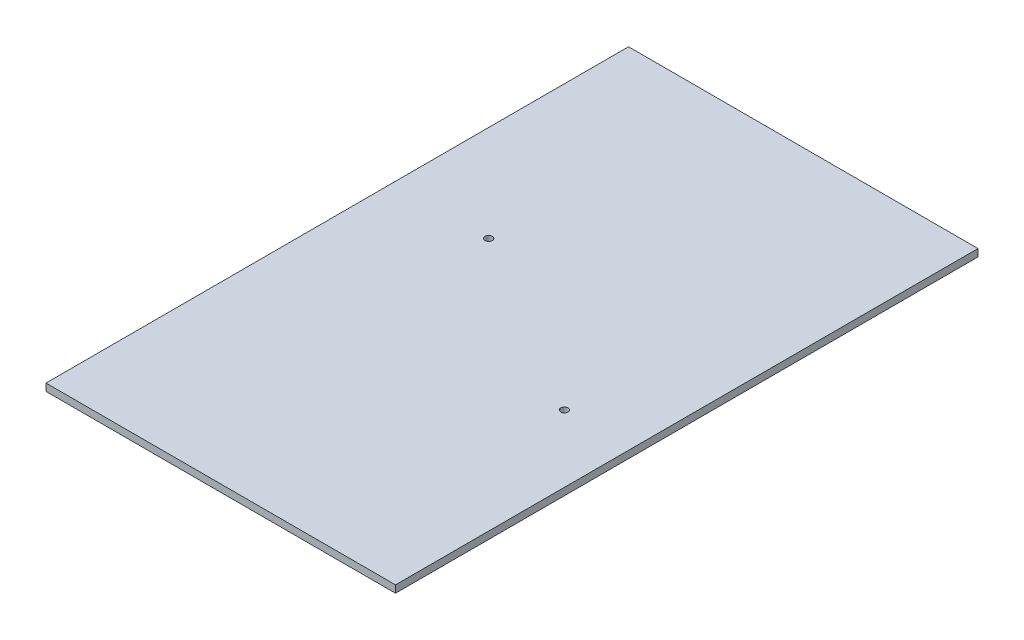
ISO-10303-21;
HEADER;
FILE_DESCRIPTION(('STEP AP214'),'2;1');
FILE_NAME('part.step','',(''),(''),'','','');
FILE_SCHEMA(('AUTOMOTIVE_DESIGN { 1 0 10303 214 1 1 1 1 }'));
ENDSEC;
DATA;
#1=APPLICATION_CONTEXT('core data for automotive mechanical design processes');
#2=APPLICATION_PROTOCOL_DEFINITION('international standard','automotive_design',2000,#1);
#3=PRODUCT_CONTEXT('',#1,'mechanical');
#4=PRODUCT('Part','Part','',(#3));
#5=PRODUCT_RELATED_PRODUCT_CATEGORY('part','',(#4));
#6=PRODUCT_DEFINITION_FORMATION('','',#4);
#7=PRODUCT_DEFINITION_CONTEXT('part definition',#1,'design');
#8=PRODUCT_DEFINITION('design','',#6,#7);
#9=PRODUCT_DEFINITION_SHAPE('','',#8);
#10=(LENGTH_UNIT() NAMED_UNIT(*) SI_UNIT(.MILLI.,.METRE.));
#11=(NAMED_UNIT(*) PLANE_ANGLE_UNIT() SI_UNIT($,.RADIAN.));
#12=(NAMED_UNIT(*) SI_UNIT($,.STERADIAN.) SOLID_ANGLE_UNIT());
#13=UNCERTAINTY_MEASURE_WITH_UNIT(LENGTH_MEASURE(1.E-05),#10,'distance_accuracy_value','');
#14=(GEOMETRIC_REPRESENTATION_CONTEXT(3) GLOBAL_UNCERTAINTY_ASSIGNED_CONTEXT((#13)) GLOBAL_UNIT_ASSIGNED_CONTEXT((#10,
#11,#12)) REPRESENTATION_CONTEXT('',''));
#15=CARTESIAN_POINT('',(0.,0.,0.));
#16=DIRECTION('',(0.,0.,1.));
#17=DIRECTION('',(1.,0.,0.));
#18=AXIS2_PLACEMENT_3D('',#15,#16,#17);
#19=CARTESIAN_POINT('',(76.2,3.175,127.));
#20=DIRECTION('',(-1.,0.,0.));
#21=DIRECTION('',(0.,0.,1.));
#22=AXIS2_PLACEMENT_3D('',#19,#20,#21);
#23=PLANE('',#22);
#24=DIRECTION('',(0.,0.,-1.));
#25=VECTOR('',#24,1.);
#26=CARTESIAN_POINT('',(76.2,0.,127.));
#27=LINE('',#26,#25);
#28=CARTESIAN_POINT('',(76.2,0.,127.));
#29=VERTEX_POINT('',#28);
#30=CARTESIAN_POINT('',(76.2,0.,-127.));
#31=VERTEX_POINT('',#30);
#32=EDGE_CURVE('E95',#29,#31,#27,.T.);
#33=ORIENTED_EDGE('',*,*,#32,.T.);
#34=DIRECTION('',(0.,-1.,0.));
#35=VECTOR('',#34,1.);
#36=CARTESIAN_POINT('',(76.2,3.175,-127.));
#37=LINE('',#36,#35);
#38=CARTESIAN_POINT('',(76.2,3.175,-127.));
#39=VERTEX_POINT('',#38);
#40=EDGE_CURVE('E11',#39,#31,#37,.T.);
#41=ORIENTED_EDGE('',*,*,#40,.F.);
#42=DIRECTION('',(0.,0.,-1.));
#43=VECTOR('',#42,1.);
#44=CARTESIAN_POINT('',(76.2,3.175,127.));
#45=LINE('',#44,#43);
#46=CARTESIAN_POINT('',(76.2,3.175,127.));
#47=VERTEX_POINT('',#46);
#48=EDGE_CURVE('E83',#47,#39,#45,.T.);
#49=ORIENTED_EDGE('',*,*,#48,.F.);
#50=DIRECTION('',(0.,-1.,0.));
#51=VECTOR('',#50,1.);
#52=CARTESIAN_POINT('',(76.2,3.175,127.));
#53=LINE('',#52,#51);
#54=EDGE_CURVE('E91',#47,#29,#53,.T.);
#55=ORIENTED_EDGE('',*,*,#54,.T.);
#56=EDGE_LOOP('',(#33,#41,#49,#55));
#57=FACE_BOUND('',#56,.T.);
#58=ADVANCED_FACE('F32',(#57),#23,.F.);
#59=CARTESIAN_POINT('',(-76.2,3.175,-127.));
#60=DIRECTION('',(0.,0.,1.));
#61=DIRECTION('',(1.,0.,0.));
#62=AXIS2_PLACEMENT_3D('',#59,#60,#61);
#63=PLANE('',#62);
#64=DIRECTION('',(-1.,0.,0.));
#65=VECTOR('',#64,1.);
#66=CARTESIAN_POINT('',(-76.2,0.,-127.));
#67=LINE('',#66,#65);
#68=CARTESIAN_POINT('',(-76.2,0.,-127.));
#69=VERTEX_POINT('',#68);
#70=EDGE_CURVE('E87',#31,#69,#67,.T.);
#71=ORIENTED_EDGE('',*,*,#70,.T.);
#72=DIRECTION('',(0.,-1.,0.));
#73=VECTOR('',#72,1.);
#74=CARTESIAN_POINT('',(-76.2,3.175,-127.));
#75=LINE('',#74,#73);
#76=CARTESIAN_POINT('',(-76.2,3.175,-127.));
#77=VERTEX_POINT('',#76);
#78=EDGE_CURVE('E40',#77,#69,#75,.T.);
#79=ORIENTED_EDGE('',*,*,#78,.F.);
#80=DIRECTION('',(-1.,0.,0.));
#81=VECTOR('',#80,1.);
#82=CARTESIAN_POINT('',(-76.2,3.175,-127.));
#83=LINE('',#82,#81);
#84=EDGE_CURVE('E78',#39,#77,#83,.T.);
#85=ORIENTED_EDGE('',*,*,#84,.F.);
#86=ORIENTED_EDGE('',*,*,#40,.T.);
#87=EDGE_LOOP('',(#71,#79,#85,#86));
#88=FACE_BOUND('',#87,.T.);
#89=ADVANCED_FACE('F86',(#88),#63,.F.);
#90=CARTESIAN_POINT('',(-76.2,3.175,127.));
#91=DIRECTION('',(1.,0.,0.));
#92=DIRECTION('',(0.,0.,-1.));
#93=AXIS2_PLACEMENT_3D('',#90,#91,#92);
#94=PLANE('',#93);
#95=DIRECTION('',(0.,0.,1.));
#96=VECTOR('',#95,1.);
#97=CARTESIAN_POINT('',(-76.2,0.,127.));
#98=LINE('',#97,#96);
#99=CARTESIAN_POINT('',(-76.2,0.,127.));
#100=VERTEX_POINT('',#99);
#101=EDGE_CURVE('E65',#69,#100,#98,.T.);
#102=ORIENTED_EDGE('',*,*,#101,.T.);
#103=DIRECTION('',(0.,-1.,0.));
#104=VECTOR('',#103,1.);
#105=CARTESIAN_POINT('',(-76.2,3.175,127.));
#106=LINE('',#105,#104);
#107=CARTESIAN_POINT('',(-76.2,3.175,127.));
#108=VERTEX_POINT('',#107);
#109=EDGE_CURVE('E88',#108,#100,#106,.T.);
#110=ORIENTED_EDGE('',*,*,#109,.F.);
#111=DIRECTION('',(0.,0.,1.));
#112=VECTOR('',#111,1.);
#113=CARTESIAN_POINT('',(-76.2,3.175,127.));
#114=LINE('',#113,#112);
#115=EDGE_CURVE('E81',#77,#108,#114,.T.);
#116=ORIENTED_EDGE('',*,*,#115,.F.);
#117=ORIENTED_EDGE('',*,*,#78,.T.);
#118=EDGE_LOOP('',(#102,#110,#116,#117));
#119=FACE_BOUND('',#118,.T.);
#120=ADVANCED_FACE('F89',(#119),#94,.F.);
#121=CARTESIAN_POINT('',(-76.2,3.175,127.));
#122=DIRECTION('',(0.,0.,-1.));
#123=DIRECTION('',(-1.,0.,0.));
#124=AXIS2_PLACEMENT_3D('',#121,#122,#123);
#125=PLANE('',#124);
#126=DIRECTION('',(1.,0.,0.));
#127=VECTOR('',#126,1.);
#128=CARTESIAN_POINT('',(-76.2,0.,127.));
#129=LINE('',#128,#127);
#130=EDGE_CURVE('E71',#100,#29,#129,.T.);
#131=ORIENTED_EDGE('',*,*,#130,.T.);
#132=ORIENTED_EDGE('',*,*,#54,.F.);
#133=DIRECTION('',(1.,0.,0.));
#134=VECTOR('',#133,1.);
#135=CARTESIAN_POINT('',(-76.2,3.175,127.));
#136=LINE('',#135,#134);
#137=EDGE_CURVE('E48',#108,#47,#136,.T.);
#138=ORIENTED_EDGE('',*,*,#137,.F.);
#139=ORIENTED_EDGE('',*,*,#109,.T.);
#140=EDGE_LOOP('',(#131,#132,#138,#139));
#141=FACE_BOUND('',#140,.T.);
#142=ADVANCED_FACE('F103',(#141),#125,.F.);
#143=CARTESIAN_POINT('',(0.,3.175,0.));
#144=DIRECTION('',(0.,-1.,0.));
#145=DIRECTION('',(0.,0.,-1.));
#146=AXIS2_PLACEMENT_3D('',#143,#144,#145);
#147=PLANE('',#146);
#148=CARTESIAN_POINT('',(46.99,3.175,24.13));
#149=DIRECTION('',(0.,1.,0.));
#150=DIRECTION('',(0.,0.,1.));
#151=AXIS2_PLACEMENT_3D('',#148,#149,#150);
#152=CIRCLE('',#151,1.5875);
#153=CARTESIAN_POINT('',(46.99,3.175,25.7175));
#154=VERTEX_POINT('',#153);
#155=EDGE_CURVE('E115',#154,#154,#152,.T.);
#156=ORIENTED_EDGE('',*,*,#155,.F.);
#157=EDGE_LOOP('',(#156));
#158=FACE_BOUND('',#157,.T.);
#159=CARTESIAN_POINT('',(-34.29,3.175,-24.13));
#160=DIRECTION('',(0.,1.,0.));
#161=DIRECTION('',(0.,0.,1.));
#162=AXIS2_PLACEMENT_3D('',#159,#160,#161);
#163=CIRCLE('',#162,1.5875);
#164=CARTESIAN_POINT('',(-34.29,3.175,-22.5425));
#165=VERTEX_POINT('',#164);
#166=EDGE_CURVE('E109',#165,#165,#163,.T.);
#167=ORIENTED_EDGE('',*,*,#166,.F.);
#168=EDGE_LOOP('',(#167));
#169=FACE_BOUND('',#168,.T.);
#170=ORIENTED_EDGE('',*,*,#48,.T.);
#171=ORIENTED_EDGE('',*,*,#84,.T.);
#172=ORIENTED_EDGE('',*,*,#115,.T.);
#173=ORIENTED_EDGE('',*,*,#137,.T.);
#174=EDGE_LOOP('',(#170,#171,#172,#173));
#175=FACE_BOUND('',#174,.T.);
#176=ADVANCED_FACE('F79',(#158,#169,#175),#147,.F.);
#177=CARTESIAN_POINT('',(0.,0.,0.));
#178=DIRECTION('',(0.,-1.,0.));
#179=DIRECTION('',(0.,0.,-1.));
#180=AXIS2_PLACEMENT_3D('',#177,#178,#179);
#181=PLANE('',#180);
#182=CARTESIAN_POINT('',(46.99,0.,24.13));
#183=DIRECTION('',(0.,1.,0.));
#184=DIRECTION('',(0.,0.,1.));
#185=AXIS2_PLACEMENT_3D('',#182,#183,#184);
#186=CIRCLE('',#185,1.5875);
#187=CARTESIAN_POINT('',(46.99,0.,25.7175));
#188=VERTEX_POINT('',#187);
#189=EDGE_CURVE('E112',#188,#188,#186,.T.);
#190=ORIENTED_EDGE('',*,*,#189,.T.);
#191=EDGE_LOOP('',(#190));
#192=FACE_BOUND('',#191,.T.);
#193=CARTESIAN_POINT('',(-34.29,0.,-24.13));
#194=DIRECTION('',(0.,1.,0.));
#195=DIRECTION('',(0.,0.,1.));
#196=AXIS2_PLACEMENT_3D('',#193,#194,#195);
#197=CIRCLE('',#196,1.5875);
#198=CARTESIAN_POINT('',(-34.29,0.,-22.5425));
#199=VERTEX_POINT('',#198);
#200=EDGE_CURVE('E98',#199,#199,#197,.T.);
#201=ORIENTED_EDGE('',*,*,#200,.T.);
#202=EDGE_LOOP('',(#201));
#203=FACE_BOUND('',#202,.T.);
#204=ORIENTED_EDGE('',*,*,#32,.F.);
#205=ORIENTED_EDGE('',*,*,#130,.F.);
#206=ORIENTED_EDGE('',*,*,#101,.F.);
#207=ORIENTED_EDGE('',*,*,#70,.F.);
#208=EDGE_LOOP('',(#204,#205,#206,#207));
#209=FACE_BOUND('',#208,.T.);
#210=ADVANCED_FACE('F106',(#192,#203,#209),#181,.T.);
#211=CARTESIAN_POINT('',(-34.29,0.,-24.13));
#212=DIRECTION('',(0.,1.,0.));
#213=DIRECTION('',(0.,0.,1.));
#214=AXIS2_PLACEMENT_3D('',#211,#212,#213);
#215=CYLINDRICAL_SURFACE('',#214,1.5875);
#216=ORIENTED_EDGE('',*,*,#200,.F.);
#217=EDGE_LOOP('',(#216));
#218=FACE_BOUND('',#217,.T.);
#219=ORIENTED_EDGE('',*,*,#166,.T.);
#220=EDGE_LOOP('',(#219));
#221=FACE_BOUND('',#220,.T.);
#222=ADVANCED_FACE('F126',(#218,#221),#215,.F.);
#223=CARTESIAN_POINT('',(46.99,0.,24.13));
#224=DIRECTION('',(0.,1.,0.));
#225=DIRECTION('',(0.,0.,1.));
#226=AXIS2_PLACEMENT_3D('',#223,#224,#225);
#227=CYLINDRICAL_SURFACE('',#226,1.5875);
#228=ORIENTED_EDGE('',*,*,#189,.F.);
#229=EDGE_LOOP('',(#228));
#230=FACE_BOUND('',#229,.T.);
#231=ORIENTED_EDGE('',*,*,#155,.T.);
#232=EDGE_LOOP('',(#231));
#233=FACE_BOUND('',#232,.T.);
#234=ADVANCED_FACE('F123',(#230,#233),#227,.F.);
#235=CLOSED_SHELL('',(#58,#89,#120,#142,#176,#210,#222,#234));
#236=MANIFOLD_SOLID_BREP('B2',#235);
#237=ADVANCED_BREP_SHAPE_REPRESENTATION('',(#18,#236),#14);
#238=SHAPE_DEFINITION_REPRESENTATION(#9,#237);
ENDSEC;
END-ISO-10303-21;
